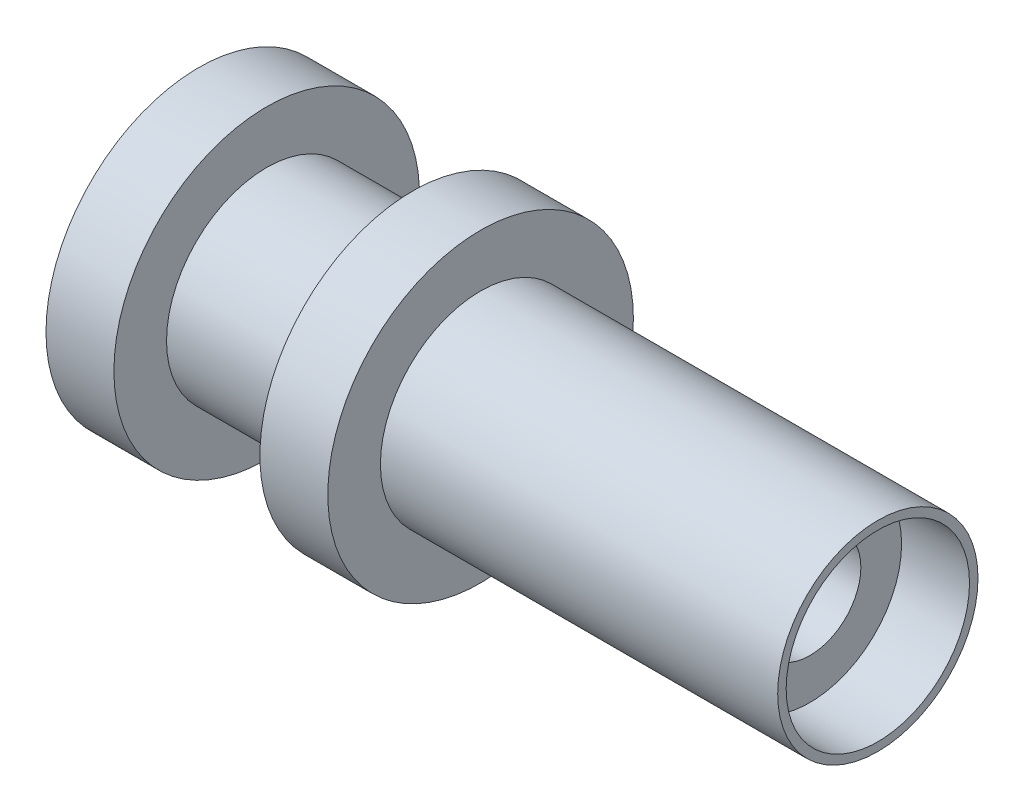
ISO-10303-21;
HEADER;
FILE_DESCRIPTION(('STEP AP214'),'2;1');
FILE_NAME('part.step','',(''),(''),'','','');
FILE_SCHEMA(('AUTOMOTIVE_DESIGN { 1 0 10303 214 1 1 1 1 }'));
ENDSEC;
DATA;
#1=APPLICATION_CONTEXT('core data for automotive mechanical design processes');
#2=APPLICATION_PROTOCOL_DEFINITION('international standard','automotive_design',2000,#1);
#3=PRODUCT_CONTEXT('',#1,'mechanical');
#4=PRODUCT('Part','Part','',(#3));
#5=PRODUCT_RELATED_PRODUCT_CATEGORY('part','',(#4));
#6=PRODUCT_DEFINITION_FORMATION('','',#4);
#7=PRODUCT_DEFINITION_CONTEXT('part definition',#1,'design');
#8=PRODUCT_DEFINITION('design','',#6,#7);
#9=PRODUCT_DEFINITION_SHAPE('','',#8);
#10=(LENGTH_UNIT() NAMED_UNIT(*) SI_UNIT(.MILLI.,.METRE.));
#11=(NAMED_UNIT(*) PLANE_ANGLE_UNIT() SI_UNIT($,.RADIAN.));
#12=(NAMED_UNIT(*) SI_UNIT($,.STERADIAN.) SOLID_ANGLE_UNIT());
#13=UNCERTAINTY_MEASURE_WITH_UNIT(LENGTH_MEASURE(1.E-05),#10,'distance_accuracy_value','');
#14=(GEOMETRIC_REPRESENTATION_CONTEXT(3) GLOBAL_UNCERTAINTY_ASSIGNED_CONTEXT((#13)) GLOBAL_UNIT_ASSIGNED_CONTEXT((#10,
#11,#12)) REPRESENTATION_CONTEXT('',''));
#15=CARTESIAN_POINT('',(0.,0.,0.));
#16=DIRECTION('',(0.,0.,1.));
#17=DIRECTION('',(1.,0.,0.));
#18=AXIS2_PLACEMENT_3D('',#15,#16,#17);
#19=CARTESIAN_POINT('',(-2.,0.,0.));
#20=DIRECTION('',(-1.,0.,0.));
#21=DIRECTION('',(0.,0.,1.));
#22=AXIS2_PLACEMENT_3D('',#19,#20,#21);
#23=PLANE('',#22);
#24=CARTESIAN_POINT('',(-2.,0.,0.));
#25=DIRECTION('',(-1.,0.,0.));
#26=DIRECTION('',(0.,0.,1.));
#27=AXIS2_PLACEMENT_3D('',#24,#25,#26);
#28=CIRCLE('',#27,4.5);
#29=CARTESIAN_POINT('',(-2.,0.,4.5));
#30=VERTEX_POINT('',#29);
#31=EDGE_CURVE('E147',#30,#30,#28,.T.);
#32=ORIENTED_EDGE('',*,*,#31,.T.);
#33=EDGE_LOOP('',(#32));
#34=FACE_BOUND('',#33,.T.);
#35=DIRECTION('',(0.,-1.,0.));
#36=VECTOR('',#35,1.);
#37=CARTESIAN_POINT('',(-2.,0.,2.75));
#38=LINE('',#37,#36);
#39=CARTESIAN_POINT('',(-2.,1.58771324027147,2.75));
#40=VERTEX_POINT('',#39);
#41=CARTESIAN_POINT('',(-2.,-1.58771324027147,2.75));
#42=VERTEX_POINT('',#41);
#43=EDGE_CURVE('E49',#40,#42,#38,.T.);
#44=ORIENTED_EDGE('',*,*,#43,.T.);
#45=DIRECTION('',(0.,-0.5,-0.866025403784439));
#46=VECTOR('',#45,1.);
#47=CARTESIAN_POINT('',(-2.,-2.38156986040721,1.375));
#48=LINE('',#47,#46);
#49=CARTESIAN_POINT('',(-2.,-3.17542648054294,0.));
#50=VERTEX_POINT('',#49);
#51=EDGE_CURVE('E11',#42,#50,#48,.T.);
#52=ORIENTED_EDGE('',*,*,#51,.T.);
#53=DIRECTION('',(0.,0.5,-0.866025403784439));
#54=VECTOR('',#53,1.);
#55=CARTESIAN_POINT('',(-2.,-2.38156986040721,-1.375));
#56=LINE('',#55,#54);
#57=CARTESIAN_POINT('',(-2.,-1.58771324027147,-2.75));
#58=VERTEX_POINT('',#57);
#59=EDGE_CURVE('E142',#50,#58,#56,.T.);
#60=ORIENTED_EDGE('',*,*,#59,.T.);
#61=DIRECTION('',(0.,1.,0.));
#62=VECTOR('',#61,1.);
#63=CARTESIAN_POINT('',(-2.,0.,-2.75));
#64=LINE('',#63,#62);
#65=CARTESIAN_POINT('',(-2.,1.58771324027147,-2.75));
#66=VERTEX_POINT('',#65);
#67=EDGE_CURVE('E170',#58,#66,#64,.T.);
#68=ORIENTED_EDGE('',*,*,#67,.T.);
#69=DIRECTION('',(0.,0.5,0.866025403784439));
#70=VECTOR('',#69,1.);
#71=CARTESIAN_POINT('',(-2.,2.38156986040721,-1.375));
#72=LINE('',#71,#70);
#73=CARTESIAN_POINT('',(-2.,3.17542648054294,0.));
#74=VERTEX_POINT('',#73);
#75=EDGE_CURVE('E173',#66,#74,#72,.T.);
#76=ORIENTED_EDGE('',*,*,#75,.T.);
#77=DIRECTION('',(0.,-0.5,0.866025403784439));
#78=VECTOR('',#77,1.);
#79=CARTESIAN_POINT('',(-2.,2.38156986040721,1.375));
#80=LINE('',#79,#78);
#81=EDGE_CURVE('E176',#74,#40,#80,.T.);
#82=ORIENTED_EDGE('',*,*,#81,.T.);
#83=EDGE_LOOP('',(#44,#52,#60,#68,#76,#82));
#84=FACE_BOUND('',#83,.T.);
#85=ADVANCED_FACE('F41',(#34,#84),#23,.T.);
#86=CARTESIAN_POINT('',(0.,0.,0.));
#87=DIRECTION('',(1.,0.,0.));
#88=DIRECTION('',(0.,0.,-1.));
#89=AXIS2_PLACEMENT_3D('',#86,#87,#88);
#90=CYLINDRICAL_SURFACE('',#89,1.5);
#91=CARTESIAN_POINT('',(16.,0.,0.));
#92=DIRECTION('',(1.,0.,0.));
#93=DIRECTION('',(0.,0.,-1.));
#94=AXIS2_PLACEMENT_3D('',#91,#92,#93);
#95=CIRCLE('',#94,1.5);
#96=CARTESIAN_POINT('',(16.,0.,-1.5));
#97=VERTEX_POINT('',#96);
#98=EDGE_CURVE('E159',#97,#97,#95,.T.);
#99=ORIENTED_EDGE('',*,*,#98,.T.);
#100=EDGE_LOOP('',(#99));
#101=FACE_BOUND('',#100,.T.);
#102=CARTESIAN_POINT('',(-1.,0.,0.));
#103=DIRECTION('',(-1.,0.,0.));
#104=DIRECTION('',(0.,0.,1.));
#105=AXIS2_PLACEMENT_3D('',#102,#103,#104);
#106=CIRCLE('',#105,1.5);
#107=CARTESIAN_POINT('',(-1.,0.,1.5));
#108=VERTEX_POINT('',#107);
#109=EDGE_CURVE('E99',#108,#108,#106,.F.);
#110=ORIENTED_EDGE('',*,*,#109,.F.);
#111=EDGE_LOOP('',(#110));
#112=FACE_BOUND('',#111,.T.);
#113=ADVANCED_FACE('F198',(#101,#112),#90,.F.);
#114=CARTESIAN_POINT('',(18.,0.,0.));
#115=DIRECTION('',(-1.,0.,0.));
#116=DIRECTION('',(0.,0.,1.));
#117=AXIS2_PLACEMENT_3D('',#114,#115,#116);
#118=CYLINDRICAL_SURFACE('',#117,2.95);
#119=CARTESIAN_POINT('',(0.,0.,0.));
#120=DIRECTION('',(1.,0.,0.));
#121=DIRECTION('',(0.,0.,-1.));
#122=AXIS2_PLACEMENT_3D('',#119,#120,#121);
#123=CIRCLE('',#122,2.95);
#124=CARTESIAN_POINT('',(0.,0.,-2.95));
#125=VERTEX_POINT('',#124);
#126=EDGE_CURVE('E150',#125,#125,#123,.T.);
#127=ORIENTED_EDGE('',*,*,#126,.T.);
#128=EDGE_LOOP('',(#127));
#129=FACE_BOUND('',#128,.T.);
#130=CARTESIAN_POINT('',(4.30000000000008,0.,0.));
#131=DIRECTION('',(1.,0.,0.));
#132=DIRECTION('',(0.,0.,-1.));
#133=AXIS2_PLACEMENT_3D('',#130,#131,#132);
#134=CIRCLE('',#133,2.95);
#135=CARTESIAN_POINT('',(4.30000000000008,0.,-2.95));
#136=VERTEX_POINT('',#135);
#137=EDGE_CURVE('E139',#136,#136,#134,.T.);
#138=ORIENTED_EDGE('',*,*,#137,.F.);
#139=EDGE_LOOP('',(#138));
#140=FACE_BOUND('',#139,.T.);
#141=ADVANCED_FACE('F205',(#129,#140),#118,.T.);
#142=CARTESIAN_POINT('',(0.,0.,0.));
#143=DIRECTION('',(-1.,0.,0.));
#144=DIRECTION('',(0.,0.,1.));
#145=AXIS2_PLACEMENT_3D('',#142,#143,#144);
#146=PLANE('',#145);
#147=ORIENTED_EDGE('',*,*,#126,.F.);
#148=EDGE_LOOP('',(#147));
#149=FACE_BOUND('',#148,.T.);
#150=CARTESIAN_POINT('',(0.,0.,0.));
#151=DIRECTION('',(-1.,0.,0.));
#152=DIRECTION('',(0.,0.,1.));
#153=AXIS2_PLACEMENT_3D('',#150,#151,#152);
#154=CIRCLE('',#153,4.5);
#155=CARTESIAN_POINT('',(0.,0.,4.5));
#156=VERTEX_POINT('',#155);
#157=EDGE_CURVE('E146',#156,#156,#154,.T.);
#158=ORIENTED_EDGE('',*,*,#157,.F.);
#159=EDGE_LOOP('',(#158));
#160=FACE_BOUND('',#159,.T.);
#161=ADVANCED_FACE('F212',(#149,#160),#146,.F.);
#162=CARTESIAN_POINT('',(-2.,0.,0.));
#163=DIRECTION('',(1.,0.,0.));
#164=DIRECTION('',(0.,0.,-1.));
#165=AXIS2_PLACEMENT_3D('',#162,#163,#164);
#166=CYLINDRICAL_SURFACE('',#165,4.5);
#167=ORIENTED_EDGE('',*,*,#31,.F.);
#168=EDGE_LOOP('',(#167));
#169=FACE_BOUND('',#168,.T.);
#170=ORIENTED_EDGE('',*,*,#157,.T.);
#171=EDGE_LOOP('',(#170));
#172=FACE_BOUND('',#171,.T.);
#173=ADVANCED_FACE('F215',(#169,#172),#166,.T.);
#174=CARTESIAN_POINT('',(6.30000000000008,0.,0.));
#175=DIRECTION('',(1.,0.,0.));
#176=DIRECTION('',(0.,0.,-1.));
#177=AXIS2_PLACEMENT_3D('',#174,#175,#176);
#178=PLANE('',#177);
#179=CARTESIAN_POINT('',(6.30000000000008,0.,0.));
#180=DIRECTION('',(1.,0.,0.));
#181=DIRECTION('',(0.,0.,-1.));
#182=AXIS2_PLACEMENT_3D('',#179,#180,#181);
#183=CIRCLE('',#182,4.5);
#184=CARTESIAN_POINT('',(6.30000000000008,0.,-4.5));
#185=VERTEX_POINT('',#184);
#186=EDGE_CURVE('E132',#185,#185,#183,.T.);
#187=ORIENTED_EDGE('',*,*,#186,.T.);
#188=EDGE_LOOP('',(#187));
#189=FACE_BOUND('',#188,.T.);
#190=CARTESIAN_POINT('',(6.30000000000008,0.,0.));
#191=DIRECTION('',(1.,0.,0.));
#192=DIRECTION('',(0.,0.,-1.));
#193=AXIS2_PLACEMENT_3D('',#190,#191,#192);
#194=CIRCLE('',#193,2.95);
#195=CARTESIAN_POINT('',(6.30000000000008,0.,-2.95));
#196=VERTEX_POINT('',#195);
#197=EDGE_CURVE('E135',#196,#196,#194,.T.);
#198=ORIENTED_EDGE('',*,*,#197,.F.);
#199=EDGE_LOOP('',(#198));
#200=FACE_BOUND('',#199,.T.);
#201=ADVANCED_FACE('F218',(#189,#200),#178,.T.);
#202=CARTESIAN_POINT('',(4.30000000000008,0.,0.));
#203=DIRECTION('',(1.,0.,0.));
#204=DIRECTION('',(0.,0.,-1.));
#205=AXIS2_PLACEMENT_3D('',#202,#203,#204);
#206=PLANE('',#205);
#207=CARTESIAN_POINT('',(4.30000000000008,0.,0.));
#208=DIRECTION('',(1.,0.,0.));
#209=DIRECTION('',(0.,0.,-1.));
#210=AXIS2_PLACEMENT_3D('',#207,#208,#209);
#211=CIRCLE('',#210,4.5);
#212=CARTESIAN_POINT('',(4.30000000000008,0.,-4.5));
#213=VERTEX_POINT('',#212);
#214=EDGE_CURVE('E136',#213,#213,#211,.T.);
#215=ORIENTED_EDGE('',*,*,#214,.F.);
#216=EDGE_LOOP('',(#215));
#217=FACE_BOUND('',#216,.T.);
#218=ORIENTED_EDGE('',*,*,#137,.T.);
#219=EDGE_LOOP('',(#218));
#220=FACE_BOUND('',#219,.T.);
#221=ADVANCED_FACE('F235',(#217,#220),#206,.F.);
#222=CARTESIAN_POINT('',(6.30000000000008,0.,0.));
#223=DIRECTION('',(-1.,0.,0.));
#224=DIRECTION('',(0.,0.,1.));
#225=AXIS2_PLACEMENT_3D('',#222,#223,#224);
#226=CYLINDRICAL_SURFACE('',#225,4.5);
#227=ORIENTED_EDGE('',*,*,#186,.F.);
#228=EDGE_LOOP('',(#227));
#229=FACE_BOUND('',#228,.T.);
#230=ORIENTED_EDGE('',*,*,#214,.T.);
#231=EDGE_LOOP('',(#230));
#232=FACE_BOUND('',#231,.T.);
#233=ADVANCED_FACE('F210',(#229,#232),#226,.T.);
#234=CARTESIAN_POINT('',(18.,0.,0.));
#235=DIRECTION('',(1.,0.,0.));
#236=DIRECTION('',(0.,0.,-1.));
#237=AXIS2_PLACEMENT_3D('',#234,#235,#236);
#238=PLANE('',#237);
#239=CARTESIAN_POINT('',(18.,0.,0.));
#240=DIRECTION('',(1.,0.,0.));
#241=DIRECTION('',(0.,0.,-1.));
#242=AXIS2_PLACEMENT_3D('',#239,#240,#241);
#243=CIRCLE('',#242,2.7);
#244=CARTESIAN_POINT('',(18.,0.,-2.7));
#245=VERTEX_POINT('',#244);
#246=EDGE_CURVE('E156',#245,#245,#243,.T.);
#247=ORIENTED_EDGE('',*,*,#246,.F.);
#248=EDGE_LOOP('',(#247));
#249=FACE_BOUND('',#248,.T.);
#250=CARTESIAN_POINT('',(18.,0.,0.));
#251=DIRECTION('',(1.,0.,0.));
#252=DIRECTION('',(0.,0.,-1.));
#253=AXIS2_PLACEMENT_3D('',#250,#251,#252);
#254=CIRCLE('',#253,2.95);
#255=CARTESIAN_POINT('',(18.,0.,-2.95));
#256=VERTEX_POINT('',#255);
#257=EDGE_CURVE('E143',#256,#256,#254,.T.);
#258=ORIENTED_EDGE('',*,*,#257,.T.);
#259=EDGE_LOOP('',(#258));
#260=FACE_BOUND('',#259,.T.);
#261=ADVANCED_FACE('F228',(#249,#260),#238,.T.);
#262=ORIENTED_EDGE('',*,*,#197,.T.);
#263=EDGE_LOOP('',(#262));
#264=FACE_BOUND('',#263,.T.);
#265=ORIENTED_EDGE('',*,*,#257,.F.);
#266=EDGE_LOOP('',(#265));
#267=FACE_BOUND('',#266,.T.);
#268=ADVANCED_FACE('F43',(#264,#267),#118,.T.);
#269=CARTESIAN_POINT('',(16.,0.,0.));
#270=DIRECTION('',(1.,0.,0.));
#271=DIRECTION('',(0.,0.,-1.));
#272=AXIS2_PLACEMENT_3D('',#269,#270,#271);
#273=CYLINDRICAL_SURFACE('',#272,2.7);
#274=CARTESIAN_POINT('',(16.,0.,0.));
#275=DIRECTION('',(1.,0.,0.));
#276=DIRECTION('',(0.,0.,-1.));
#277=AXIS2_PLACEMENT_3D('',#274,#275,#276);
#278=CIRCLE('',#277,2.7);
#279=CARTESIAN_POINT('',(16.,0.,-2.7));
#280=VERTEX_POINT('',#279);
#281=EDGE_CURVE('E153',#280,#280,#278,.T.);
#282=ORIENTED_EDGE('',*,*,#281,.F.);
#283=EDGE_LOOP('',(#282));
#284=FACE_BOUND('',#283,.T.);
#285=ORIENTED_EDGE('',*,*,#246,.T.);
#286=EDGE_LOOP('',(#285));
#287=FACE_BOUND('',#286,.T.);
#288=ADVANCED_FACE('F224',(#284,#287),#273,.F.);
#289=CARTESIAN_POINT('',(16.,0.,0.));
#290=DIRECTION('',(1.,0.,0.));
#291=DIRECTION('',(0.,0.,-1.));
#292=AXIS2_PLACEMENT_3D('',#289,#290,#291);
#293=PLANE('',#292);
#294=ORIENTED_EDGE('',*,*,#98,.F.);
#295=EDGE_LOOP('',(#294));
#296=FACE_BOUND('',#295,.T.);
#297=ORIENTED_EDGE('',*,*,#281,.T.);
#298=EDGE_LOOP('',(#297));
#299=FACE_BOUND('',#298,.T.);
#300=ADVANCED_FACE('F221',(#296,#299),#293,.T.);
#301=CARTESIAN_POINT('',(-1.,0.,0.));
#302=DIRECTION('',(-1.,0.,0.));
#303=DIRECTION('',(0.,0.,1.));
#304=AXIS2_PLACEMENT_3D('',#301,#302,#303);
#305=PLANE('',#304);
#306=DIRECTION('',(0.,0.5,0.866025403784439));
#307=VECTOR('',#306,1.);
#308=CARTESIAN_POINT('',(-1.,-3.17542648054294,0.));
#309=LINE('',#308,#307);
#310=CARTESIAN_POINT('',(-1.,-3.17542648054294,0.));
#311=VERTEX_POINT('',#310);
#312=CARTESIAN_POINT('',(-1.,-1.58771324027147,2.75));
#313=VERTEX_POINT('',#312);
#314=EDGE_CURVE('E95',#311,#313,#309,.T.);
#315=ORIENTED_EDGE('',*,*,#314,.T.);
#316=DIRECTION('',(0.,1.,0.));
#317=VECTOR('',#316,1.);
#318=CARTESIAN_POINT('',(-1.,-1.58771324027147,2.75));
#319=LINE('',#318,#317);
#320=CARTESIAN_POINT('',(-1.,1.58771324027147,2.75));
#321=VERTEX_POINT('',#320);
#322=EDGE_CURVE('E103',#313,#321,#319,.T.);
#323=ORIENTED_EDGE('',*,*,#322,.T.);
#324=DIRECTION('',(0.,0.5,-0.866025403784439));
#325=VECTOR('',#324,1.);
#326=CARTESIAN_POINT('',(-1.,1.58771324027147,2.75));
#327=LINE('',#326,#325);
#328=CARTESIAN_POINT('',(-1.,3.17542648054294,0.));
#329=VERTEX_POINT('',#328);
#330=EDGE_CURVE('E109',#321,#329,#327,.T.);
#331=ORIENTED_EDGE('',*,*,#330,.T.);
#332=DIRECTION('',(0.,-0.5,-0.866025403784439));
#333=VECTOR('',#332,1.);
#334=CARTESIAN_POINT('',(-1.,3.17542648054294,0.));
#335=LINE('',#334,#333);
#336=CARTESIAN_POINT('',(-1.,1.58771324027147,-2.75));
#337=VERTEX_POINT('',#336);
#338=EDGE_CURVE('E118',#329,#337,#335,.T.);
#339=ORIENTED_EDGE('',*,*,#338,.T.);
#340=DIRECTION('',(0.,-1.,0.));
#341=VECTOR('',#340,1.);
#342=CARTESIAN_POINT('',(-1.,1.58771324027147,-2.75));
#343=LINE('',#342,#341);
#344=CARTESIAN_POINT('',(-1.,-1.58771324027147,-2.75));
#345=VERTEX_POINT('',#344);
#346=EDGE_CURVE('E121',#337,#345,#343,.T.);
#347=ORIENTED_EDGE('',*,*,#346,.T.);
#348=DIRECTION('',(0.,-0.5,0.866025403784439));
#349=VECTOR('',#348,1.);
#350=CARTESIAN_POINT('',(-1.,-1.58771324027147,-2.75));
#351=LINE('',#350,#349);
#352=EDGE_CURVE('E114',#345,#311,#351,.T.);
#353=ORIENTED_EDGE('',*,*,#352,.T.);
#354=EDGE_LOOP('',(#315,#323,#331,#339,#347,#353));
#355=FACE_BOUND('',#354,.T.);
#356=ORIENTED_EDGE('',*,*,#109,.T.);
#357=EDGE_LOOP('',(#356));
#358=FACE_BOUND('',#357,.T.);
#359=ADVANCED_FACE('F111',(#355,#358),#305,.T.);
#360=CARTESIAN_POINT('',(-2.000012,-3.17542648054294,0.));
#361=DIRECTION('',(0.,0.866025403784439,-0.5));
#362=DIRECTION('',(0.,0.5,0.866025403784439));
#363=AXIS2_PLACEMENT_3D('',#360,#361,#362);
#364=PLANE('',#363);
#365=DIRECTION('',(1.,0.,0.));
#366=VECTOR('',#365,1.);
#367=CARTESIAN_POINT('',(-2.000012,-1.58771324027147,2.75));
#368=LINE('',#367,#366);
#369=EDGE_CURVE('E91',#42,#313,#368,.T.);
#370=ORIENTED_EDGE('',*,*,#369,.T.);
#371=ORIENTED_EDGE('',*,*,#314,.F.);
#372=DIRECTION('',(1.,0.,0.));
#373=VECTOR('',#372,1.);
#374=CARTESIAN_POINT('',(-2.000012,-3.17542648054294,0.));
#375=LINE('',#374,#373);
#376=EDGE_CURVE('E124',#50,#311,#375,.T.);
#377=ORIENTED_EDGE('',*,*,#376,.F.);
#378=ORIENTED_EDGE('',*,*,#51,.F.);
#379=EDGE_LOOP('',(#370,#371,#377,#378));
#380=FACE_BOUND('',#379,.T.);
#381=ADVANCED_FACE('F93',(#380),#364,.T.);
#382=CARTESIAN_POINT('',(-2.000012,-1.58771324027147,2.75));
#383=DIRECTION('',(0.,0.,-1.));
#384=DIRECTION('',(0.,1.,0.));
#385=AXIS2_PLACEMENT_3D('',#382,#383,#384);
#386=PLANE('',#385);
#387=DIRECTION('',(1.,0.,0.));
#388=VECTOR('',#387,1.);
#389=CARTESIAN_POINT('',(-2.000012,1.58771324027147,2.75));
#390=LINE('',#389,#388);
#391=EDGE_CURVE('E100',#40,#321,#390,.T.);
#392=ORIENTED_EDGE('',*,*,#391,.T.);
#393=ORIENTED_EDGE('',*,*,#322,.F.);
#394=ORIENTED_EDGE('',*,*,#369,.F.);
#395=ORIENTED_EDGE('',*,*,#43,.F.);
#396=EDGE_LOOP('',(#392,#393,#394,#395));
#397=FACE_BOUND('',#396,.T.);
#398=ADVANCED_FACE('F104',(#397),#386,.T.);
#399=CARTESIAN_POINT('',(-2.000012,1.58771324027147,2.75));
#400=DIRECTION('',(0.,-0.866025403784439,-0.5));
#401=DIRECTION('',(0.,0.5,-0.866025403784439));
#402=AXIS2_PLACEMENT_3D('',#399,#400,#401);
#403=PLANE('',#402);
#404=DIRECTION('',(1.,0.,0.));
#405=VECTOR('',#404,1.);
#406=CARTESIAN_POINT('',(-2.000012,3.17542648054294,0.));
#407=LINE('',#406,#405);
#408=EDGE_CURVE('E129',#74,#329,#407,.T.);
#409=ORIENTED_EDGE('',*,*,#408,.T.);
#410=ORIENTED_EDGE('',*,*,#330,.F.);
#411=ORIENTED_EDGE('',*,*,#391,.F.);
#412=ORIENTED_EDGE('',*,*,#81,.F.);
#413=EDGE_LOOP('',(#409,#410,#411,#412));
#414=FACE_BOUND('',#413,.T.);
#415=ADVANCED_FACE('F180',(#414),#403,.T.);
#416=CARTESIAN_POINT('',(-2.000012,3.17542648054294,0.));
#417=DIRECTION('',(0.,-0.866025403784439,0.5));
#418=DIRECTION('',(0.,-0.5,-0.866025403784439));
#419=AXIS2_PLACEMENT_3D('',#416,#417,#418);
#420=PLANE('',#419);
#421=DIRECTION('',(1.,0.,0.));
#422=VECTOR('',#421,1.);
#423=CARTESIAN_POINT('',(-2.000012,1.58771324027147,-2.75));
#424=LINE('',#423,#422);
#425=EDGE_CURVE('E127',#66,#337,#424,.T.);
#426=ORIENTED_EDGE('',*,*,#425,.T.);
#427=ORIENTED_EDGE('',*,*,#338,.F.);
#428=ORIENTED_EDGE('',*,*,#408,.F.);
#429=ORIENTED_EDGE('',*,*,#75,.F.);
#430=EDGE_LOOP('',(#426,#427,#428,#429));
#431=FACE_BOUND('',#430,.T.);
#432=ADVANCED_FACE('F185',(#431),#420,.T.);
#433=CARTESIAN_POINT('',(-2.000012,1.58771324027147,-2.75));
#434=DIRECTION('',(0.,0.,1.));
#435=DIRECTION('',(1.,0.,0.));
#436=AXIS2_PLACEMENT_3D('',#433,#434,#435);
#437=PLANE('',#436);
#438=DIRECTION('',(1.,0.,0.));
#439=VECTOR('',#438,1.);
#440=CARTESIAN_POINT('',(-2.000012,-1.58771324027147,-2.75));
#441=LINE('',#440,#439);
#442=EDGE_CURVE('E56',#58,#345,#441,.T.);
#443=ORIENTED_EDGE('',*,*,#442,.T.);
#444=ORIENTED_EDGE('',*,*,#346,.F.);
#445=ORIENTED_EDGE('',*,*,#425,.F.);
#446=ORIENTED_EDGE('',*,*,#67,.F.);
#447=EDGE_LOOP('',(#443,#444,#445,#446));
#448=FACE_BOUND('',#447,.T.);
#449=ADVANCED_FACE('F188',(#448),#437,.T.);
#450=CARTESIAN_POINT('',(-2.000012,-1.58771324027147,-2.75));
#451=DIRECTION('',(0.,0.866025403784439,0.5));
#452=DIRECTION('',(0.,-0.5,0.866025403784439));
#453=AXIS2_PLACEMENT_3D('',#450,#451,#452);
#454=PLANE('',#453);
#455=ORIENTED_EDGE('',*,*,#376,.T.);
#456=ORIENTED_EDGE('',*,*,#352,.F.);
#457=ORIENTED_EDGE('',*,*,#442,.F.);
#458=ORIENTED_EDGE('',*,*,#59,.F.);
#459=EDGE_LOOP('',(#455,#456,#457,#458));
#460=FACE_BOUND('',#459,.T.);
#461=ADVANCED_FACE('F189',(#460),#454,.T.);
#462=CLOSED_SHELL('',(#85,#113,#141,#161,#173,#201,#221,#233,#261,#268,#288,#300,#359,#381,#398,
#415,#432,#449,#461));
#463=MANIFOLD_SOLID_BREP('B2',#462);
#464=ADVANCED_BREP_SHAPE_REPRESENTATION('',(#18,#463),#14);
#465=SHAPE_DEFINITION_REPRESENTATION(#9,#464);
ENDSEC;
END-ISO-10303-21;
